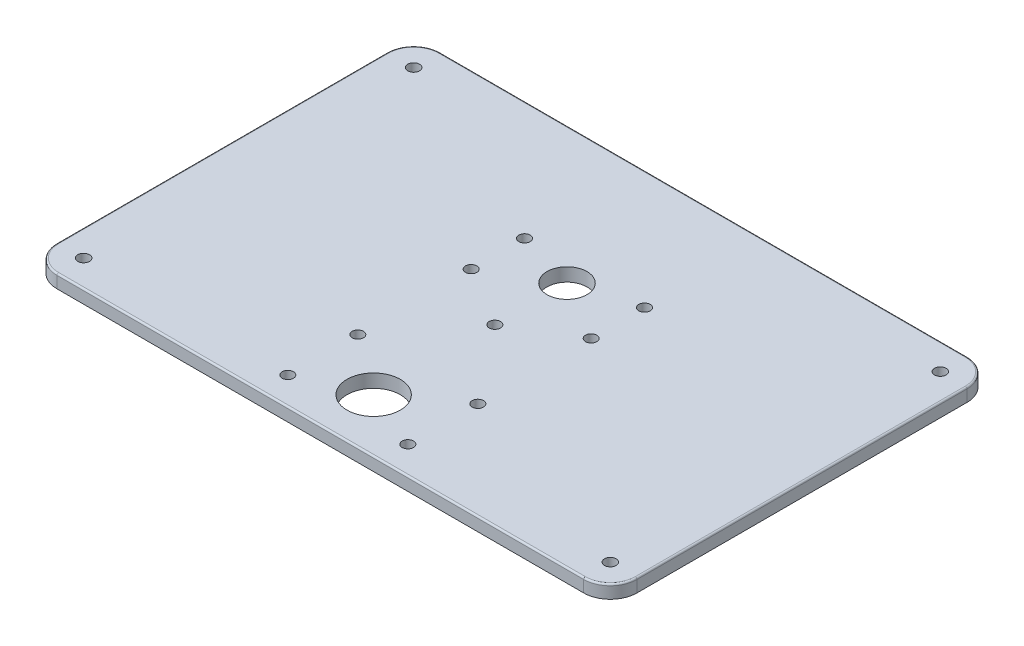
ISO-10303-21;
HEADER;
FILE_DESCRIPTION(('STEP AP214'),'2;1');
FILE_NAME('part.step','',(''),(''),'','','');
FILE_SCHEMA(('AUTOMOTIVE_DESIGN { 1 0 10303 214 1 1 1 1 }'));
ENDSEC;
DATA;
#1=APPLICATION_CONTEXT('core data for automotive mechanical design processes');
#2=APPLICATION_PROTOCOL_DEFINITION('international standard','automotive_design',2000,#1);
#3=PRODUCT_CONTEXT('',#1,'mechanical');
#4=PRODUCT('Part','Part','',(#3));
#5=PRODUCT_RELATED_PRODUCT_CATEGORY('part','',(#4));
#6=PRODUCT_DEFINITION_FORMATION('','',#4);
#7=PRODUCT_DEFINITION_CONTEXT('part definition',#1,'design');
#8=PRODUCT_DEFINITION('design','',#6,#7);
#9=PRODUCT_DEFINITION_SHAPE('','',#8);
#10=(LENGTH_UNIT() NAMED_UNIT(*) SI_UNIT(.MILLI.,.METRE.));
#11=(NAMED_UNIT(*) PLANE_ANGLE_UNIT() SI_UNIT($,.RADIAN.));
#12=(NAMED_UNIT(*) SI_UNIT($,.STERADIAN.) SOLID_ANGLE_UNIT());
#13=UNCERTAINTY_MEASURE_WITH_UNIT(LENGTH_MEASURE(1.E-05),#10,'distance_accuracy_value','');
#14=(GEOMETRIC_REPRESENTATION_CONTEXT(3) GLOBAL_UNCERTAINTY_ASSIGNED_CONTEXT((#13)) GLOBAL_UNIT_ASSIGNED_CONTEXT((#10,
#11,#12)) REPRESENTATION_CONTEXT('',''));
#15=CARTESIAN_POINT('',(0.,0.,0.));
#16=DIRECTION('',(0.,0.,1.));
#17=DIRECTION('',(1.,0.,0.));
#18=AXIS2_PLACEMENT_3D('',#15,#16,#17);
#19=CARTESIAN_POINT('',(79.,4.,11.));
#20=DIRECTION('',(0.,-1.,0.));
#21=DIRECTION('',(0.,0.,-1.));
#22=AXIS2_PLACEMENT_3D('',#19,#20,#21);
#23=PLANE('',#22);
#24=DIRECTION('',(0.,0.,1.));
#25=VECTOR('',#24,1.);
#26=CARTESIAN_POINT('',(-86.5,4.,11.));
#27=LINE('',#26,#25);
#28=CARTESIAN_POINT('',(-86.5,4.,-87.9999999999999));
#29=VERTEX_POINT('',#28);
#30=CARTESIAN_POINT('',(-86.5,4.,11.));
#31=VERTEX_POINT('',#30);
#32=EDGE_CURVE('E193',#29,#31,#27,.T.);
#33=ORIENTED_EDGE('',*,*,#32,.T.);
#34=CARTESIAN_POINT('',(-79.,4.,11.));
#35=DIRECTION('',(0.,-1.,0.));
#36=DIRECTION('',(0.,0.,-1.));
#37=AXIS2_PLACEMENT_3D('',#34,#35,#36);
#38=CIRCLE('',#37,7.50000000000002);
#39=CARTESIAN_POINT('',(-79.,4.,18.5));
#40=VERTEX_POINT('',#39);
#41=EDGE_CURVE('E195',#31,#40,#38,.F.);
#42=ORIENTED_EDGE('',*,*,#41,.T.);
#43=DIRECTION('',(1.,0.,0.));
#44=VECTOR('',#43,1.);
#45=CARTESIAN_POINT('',(79.,4.,18.5));
#46=LINE('',#45,#44);
#47=CARTESIAN_POINT('',(79.,4.,18.5));
#48=VERTEX_POINT('',#47);
#49=EDGE_CURVE('E132',#40,#48,#46,.T.);
#50=ORIENTED_EDGE('',*,*,#49,.T.);
#51=CARTESIAN_POINT('',(79.,4.,11.));
#52=DIRECTION('',(0.,-1.,0.));
#53=DIRECTION('',(0.,0.,-1.));
#54=AXIS2_PLACEMENT_3D('',#51,#52,#53);
#55=CIRCLE('',#54,7.50000000000002);
#56=CARTESIAN_POINT('',(86.5,4.,11.));
#57=VERTEX_POINT('',#56);
#58=EDGE_CURVE('E183',#48,#57,#55,.F.);
#59=ORIENTED_EDGE('',*,*,#58,.T.);
#60=DIRECTION('',(0.,0.,-1.));
#61=VECTOR('',#60,1.);
#62=CARTESIAN_POINT('',(86.5,4.,11.));
#63=LINE('',#62,#61);
#64=CARTESIAN_POINT('',(86.5,4.,-88.));
#65=VERTEX_POINT('',#64);
#66=EDGE_CURVE('E185',#57,#65,#63,.T.);
#67=ORIENTED_EDGE('',*,*,#66,.T.);
#68=CARTESIAN_POINT('',(79.,4.,-88.));
#69=DIRECTION('',(0.,-1.,0.));
#70=DIRECTION('',(0.,0.,-1.));
#71=AXIS2_PLACEMENT_3D('',#68,#69,#70);
#72=CIRCLE('',#71,7.50000000000001);
#73=CARTESIAN_POINT('',(78.9999999999999,4.,-95.5));
#74=VERTEX_POINT('',#73);
#75=EDGE_CURVE('E187',#65,#74,#72,.F.);
#76=ORIENTED_EDGE('',*,*,#75,.T.);
#77=DIRECTION('',(-1.,0.,0.));
#78=VECTOR('',#77,1.);
#79=CARTESIAN_POINT('',(78.9999999999999,4.,-95.5));
#80=LINE('',#79,#78);
#81=CARTESIAN_POINT('',(-78.9999999999999,4.,-95.5));
#82=VERTEX_POINT('',#81);
#83=EDGE_CURVE('E189',#74,#82,#80,.T.);
#84=ORIENTED_EDGE('',*,*,#83,.T.);
#85=CARTESIAN_POINT('',(-79.,4.,-88.));
#86=DIRECTION('',(0.,-1.,0.));
#87=DIRECTION('',(0.,0.,-1.));
#88=AXIS2_PLACEMENT_3D('',#85,#86,#87);
#89=CIRCLE('',#88,7.50000000000001);
#90=EDGE_CURVE('E191',#82,#29,#89,.F.);
#91=ORIENTED_EDGE('',*,*,#90,.T.);
#92=EDGE_LOOP('',(#33,#42,#50,#59,#67,#76,#84,#91));
#93=FACE_BOUND('',#92,.T.);
#94=CARTESIAN_POINT('',(0.,4.,3.00000000000002));
#95=DIRECTION('',(0.,1.,0.));
#96=DIRECTION('',(0.,0.,1.));
#97=AXIS2_PLACEMENT_3D('',#94,#95,#96);
#98=CIRCLE('',#97,8.0000000000001);
#99=CARTESIAN_POINT('',(0.,4.,11.0000000000001));
#100=VERTEX_POINT('',#99);
#101=EDGE_CURVE('E148',#100,#100,#98,.T.);
#102=ORIENTED_EDGE('',*,*,#101,.F.);
#103=EDGE_LOOP('',(#102));
#104=FACE_BOUND('',#103,.T.);
#105=CARTESIAN_POINT('',(18.,4.,10.750000000001));
#106=DIRECTION('',(0.,1.,0.));
#107=DIRECTION('',(0.,0.,1.));
#108=AXIS2_PLACEMENT_3D('',#105,#106,#107);
#109=CIRCLE('',#108,1.70000000000001);
#110=CARTESIAN_POINT('',(18.,4.,12.450000000001));
#111=VERTEX_POINT('',#110);
#112=EDGE_CURVE('E318',#111,#111,#109,.T.);
#113=ORIENTED_EDGE('',*,*,#112,.F.);
#114=EDGE_LOOP('',(#113));
#115=FACE_BOUND('',#114,.T.);
#116=CARTESIAN_POINT('',(18.,4.,-10.249999999999));
#117=DIRECTION('',(0.,1.,0.));
#118=DIRECTION('',(0.,0.,1.));
#119=AXIS2_PLACEMENT_3D('',#116,#117,#118);
#120=CIRCLE('',#119,1.70000000000001);
#121=CARTESIAN_POINT('',(18.,4.,-8.54999999999898));
#122=VERTEX_POINT('',#121);
#123=EDGE_CURVE('E312',#122,#122,#120,.T.);
#124=ORIENTED_EDGE('',*,*,#123,.F.);
#125=EDGE_LOOP('',(#124));
#126=FACE_BOUND('',#125,.T.);
#127=CARTESIAN_POINT('',(-18.,4.,10.750000000001));
#128=DIRECTION('',(0.,1.,0.));
#129=DIRECTION('',(0.,0.,1.));
#130=AXIS2_PLACEMENT_3D('',#127,#128,#129);
#131=CIRCLE('',#130,1.70000000000001);
#132=CARTESIAN_POINT('',(-18.,4.,12.450000000001));
#133=VERTEX_POINT('',#132);
#134=EDGE_CURVE('E306',#133,#133,#131,.T.);
#135=ORIENTED_EDGE('',*,*,#134,.F.);
#136=EDGE_LOOP('',(#135));
#137=FACE_BOUND('',#136,.T.);
#138=CARTESIAN_POINT('',(-18.,4.,-10.249999999999));
#139=DIRECTION('',(0.,1.,0.));
#140=DIRECTION('',(0.,0.,1.));
#141=AXIS2_PLACEMENT_3D('',#138,#139,#140);
#142=CIRCLE('',#141,1.70000000000001);
#143=CARTESIAN_POINT('',(-18.,4.,-8.54999999999898));
#144=VERTEX_POINT('',#143);
#145=EDGE_CURVE('E300',#144,#144,#142,.T.);
#146=ORIENTED_EDGE('',*,*,#145,.F.);
#147=EDGE_LOOP('',(#146));
#148=FACE_BOUND('',#147,.T.);
#149=CARTESIAN_POINT('',(0.,4.,-33.35));
#150=DIRECTION('',(0.,1.,0.));
#151=DIRECTION('',(0.,0.,1.));
#152=AXIS2_PLACEMENT_3D('',#149,#150,#151);
#153=CIRCLE('',#152,1.70000000000002);
#154=CARTESIAN_POINT('',(0.,4.,-31.65));
#155=VERTEX_POINT('',#154);
#156=EDGE_CURVE('E294',#155,#155,#153,.T.);
#157=ORIENTED_EDGE('',*,*,#156,.F.);
#158=EDGE_LOOP('',(#157));
#159=FACE_BOUND('',#158,.T.);
#160=CARTESIAN_POINT('',(18.,4.,-60.2499999999992));
#161=DIRECTION('',(0.,1.,0.));
#162=DIRECTION('',(0.,0.,1.));
#163=AXIS2_PLACEMENT_3D('',#160,#161,#162);
#164=CIRCLE('',#163,1.70000000000001);
#165=CARTESIAN_POINT('',(18.,4.,-58.5499999999992));
#166=VERTEX_POINT('',#165);
#167=EDGE_CURVE('E288',#166,#166,#164,.T.);
#168=ORIENTED_EDGE('',*,*,#167,.F.);
#169=EDGE_LOOP('',(#168));
#170=FACE_BOUND('',#169,.T.);
#171=CARTESIAN_POINT('',(18.,4.,-44.2499999999992));
#172=DIRECTION('',(0.,1.,0.));
#173=DIRECTION('',(0.,0.,1.));
#174=AXIS2_PLACEMENT_3D('',#171,#172,#173);
#175=CIRCLE('',#174,1.70000000000001);
#176=CARTESIAN_POINT('',(18.,4.,-42.5499999999992));
#177=VERTEX_POINT('',#176);
#178=EDGE_CURVE('E282',#177,#177,#175,.T.);
#179=ORIENTED_EDGE('',*,*,#178,.F.);
#180=EDGE_LOOP('',(#179));
#181=FACE_BOUND('',#180,.T.);
#182=CARTESIAN_POINT('',(-18.,4.,-44.2499999999992));
#183=DIRECTION('',(0.,1.,0.));
#184=DIRECTION('',(0.,0.,1.));
#185=AXIS2_PLACEMENT_3D('',#182,#183,#184);
#186=CIRCLE('',#185,1.70000000000001);
#187=CARTESIAN_POINT('',(-18.,4.,-42.5499999999992));
#188=VERTEX_POINT('',#187);
#189=EDGE_CURVE('E276',#188,#188,#186,.T.);
#190=ORIENTED_EDGE('',*,*,#189,.F.);
#191=EDGE_LOOP('',(#190));
#192=FACE_BOUND('',#191,.T.);
#193=CARTESIAN_POINT('',(0.,4.,-54.9999999999992));
#194=DIRECTION('',(0.,1.,0.));
#195=DIRECTION('',(0.,0.,1.));
#196=AXIS2_PLACEMENT_3D('',#193,#194,#195);
#197=CIRCLE('',#196,6.00000000000001);
#198=CARTESIAN_POINT('',(0.,4.,-48.9999999999992));
#199=VERTEX_POINT('',#198);
#200=EDGE_CURVE('E270',#199,#199,#197,.T.);
#201=ORIENTED_EDGE('',*,*,#200,.F.);
#202=EDGE_LOOP('',(#201));
#203=FACE_BOUND('',#202,.T.);
#204=CARTESIAN_POINT('',(-18.,4.,-60.2499999999992));
#205=DIRECTION('',(0.,1.,0.));
#206=DIRECTION('',(0.,0.,1.));
#207=AXIS2_PLACEMENT_3D('',#204,#205,#206);
#208=CIRCLE('',#207,1.70000000000001);
#209=CARTESIAN_POINT('',(-18.,4.,-58.5499999999992));
#210=VERTEX_POINT('',#209);
#211=EDGE_CURVE('E264',#210,#210,#208,.T.);
#212=ORIENTED_EDGE('',*,*,#211,.F.);
#213=EDGE_LOOP('',(#212));
#214=FACE_BOUND('',#213,.T.);
#215=CARTESIAN_POINT('',(-79.,4.,-88.));
#216=DIRECTION('',(0.,1.,0.));
#217=DIRECTION('',(0.,0.,1.));
#218=AXIS2_PLACEMENT_3D('',#215,#216,#217);
#219=CIRCLE('',#218,1.75000000000001);
#220=CARTESIAN_POINT('',(-79.,4.,-86.25));
#221=VERTEX_POINT('',#220);
#222=EDGE_CURVE('E258',#221,#221,#219,.T.);
#223=ORIENTED_EDGE('',*,*,#222,.F.);
#224=EDGE_LOOP('',(#223));
#225=FACE_BOUND('',#224,.T.);
#226=CARTESIAN_POINT('',(79.,4.,-88.));
#227=DIRECTION('',(0.,1.,0.));
#228=DIRECTION('',(0.,0.,1.));
#229=AXIS2_PLACEMENT_3D('',#226,#227,#228);
#230=CIRCLE('',#229,1.75000000000001);
#231=CARTESIAN_POINT('',(79.,4.,-86.25));
#232=VERTEX_POINT('',#231);
#233=EDGE_CURVE('E252',#232,#232,#230,.T.);
#234=ORIENTED_EDGE('',*,*,#233,.F.);
#235=EDGE_LOOP('',(#234));
#236=FACE_BOUND('',#235,.T.);
#237=CARTESIAN_POINT('',(79.,4.,11.));
#238=DIRECTION('',(0.,1.,0.));
#239=DIRECTION('',(0.,0.,1.));
#240=AXIS2_PLACEMENT_3D('',#237,#238,#239);
#241=CIRCLE('',#240,1.75000000000001);
#242=CARTESIAN_POINT('',(79.,4.,12.75));
#243=VERTEX_POINT('',#242);
#244=EDGE_CURVE('E246',#243,#243,#241,.T.);
#245=ORIENTED_EDGE('',*,*,#244,.F.);
#246=EDGE_LOOP('',(#245));
#247=FACE_BOUND('',#246,.T.);
#248=CARTESIAN_POINT('',(-79.,4.,11.));
#249=DIRECTION('',(0.,1.,0.));
#250=DIRECTION('',(0.,0.,1.));
#251=AXIS2_PLACEMENT_3D('',#248,#249,#250);
#252=CIRCLE('',#251,1.75000000000001);
#253=CARTESIAN_POINT('',(-79.,4.,12.75));
#254=VERTEX_POINT('',#253);
#255=EDGE_CURVE('E238',#254,#254,#252,.T.);
#256=ORIENTED_EDGE('',*,*,#255,.F.);
#257=EDGE_LOOP('',(#256));
#258=FACE_BOUND('',#257,.T.);
#259=ADVANCED_FACE('F37',(#93,#104,#115,#126,#137,#148,#159,#170,#181,#192,#203,#214,#225,#236,
#247,#258),#23,.F.);
#260=CARTESIAN_POINT('',(79.,0.,11.));
#261=DIRECTION('',(0.,-1.,0.));
#262=DIRECTION('',(0.,0.,-1.));
#263=AXIS2_PLACEMENT_3D('',#260,#261,#262);
#264=PLANE('',#263);
#265=CARTESIAN_POINT('',(79.,0.,11.));
#266=DIRECTION('',(0.,1.,0.));
#267=DIRECTION('',(0.,0.,1.));
#268=AXIS2_PLACEMENT_3D('',#265,#266,#267);
#269=CIRCLE('',#268,1.75000000000001);
#270=CARTESIAN_POINT('',(79.,0.,12.75));
#271=VERTEX_POINT('',#270);
#272=EDGE_CURVE('E243',#271,#271,#269,.T.);
#273=ORIENTED_EDGE('',*,*,#272,.T.);
#274=EDGE_LOOP('',(#273));
#275=FACE_BOUND('',#274,.T.);
#276=CARTESIAN_POINT('',(-79.,0.,-88.));
#277=DIRECTION('',(0.,1.,0.));
#278=DIRECTION('',(0.,0.,1.));
#279=AXIS2_PLACEMENT_3D('',#276,#277,#278);
#280=CIRCLE('',#279,1.75000000000001);
#281=CARTESIAN_POINT('',(-79.,0.,-86.25));
#282=VERTEX_POINT('',#281);
#283=EDGE_CURVE('E255',#282,#282,#280,.T.);
#284=ORIENTED_EDGE('',*,*,#283,.T.);
#285=EDGE_LOOP('',(#284));
#286=FACE_BOUND('',#285,.T.);
#287=CARTESIAN_POINT('',(0.,0.,-54.9999999999992));
#288=DIRECTION('',(0.,1.,0.));
#289=DIRECTION('',(0.,0.,1.));
#290=AXIS2_PLACEMENT_3D('',#287,#288,#289);
#291=CIRCLE('',#290,6.00000000000001);
#292=CARTESIAN_POINT('',(0.,0.,-48.9999999999992));
#293=VERTEX_POINT('',#292);
#294=EDGE_CURVE('E267',#293,#293,#291,.T.);
#295=ORIENTED_EDGE('',*,*,#294,.T.);
#296=EDGE_LOOP('',(#295));
#297=FACE_BOUND('',#296,.T.);
#298=CARTESIAN_POINT('',(18.,0.,-44.2499999999992));
#299=DIRECTION('',(0.,1.,0.));
#300=DIRECTION('',(0.,0.,1.));
#301=AXIS2_PLACEMENT_3D('',#298,#299,#300);
#302=CIRCLE('',#301,1.70000000000001);
#303=CARTESIAN_POINT('',(18.,0.,-42.5499999999992));
#304=VERTEX_POINT('',#303);
#305=EDGE_CURVE('E279',#304,#304,#302,.T.);
#306=ORIENTED_EDGE('',*,*,#305,.T.);
#307=EDGE_LOOP('',(#306));
#308=FACE_BOUND('',#307,.T.);
#309=CARTESIAN_POINT('',(0.,0.,-33.35));
#310=DIRECTION('',(0.,1.,0.));
#311=DIRECTION('',(0.,0.,1.));
#312=AXIS2_PLACEMENT_3D('',#309,#310,#311);
#313=CIRCLE('',#312,1.70000000000002);
#314=CARTESIAN_POINT('',(0.,0.,-31.65));
#315=VERTEX_POINT('',#314);
#316=EDGE_CURVE('E291',#315,#315,#313,.T.);
#317=ORIENTED_EDGE('',*,*,#316,.T.);
#318=EDGE_LOOP('',(#317));
#319=FACE_BOUND('',#318,.T.);
#320=CARTESIAN_POINT('',(-18.,0.,10.750000000001));
#321=DIRECTION('',(0.,1.,0.));
#322=DIRECTION('',(0.,0.,1.));
#323=AXIS2_PLACEMENT_3D('',#320,#321,#322);
#324=CIRCLE('',#323,1.70000000000001);
#325=CARTESIAN_POINT('',(-18.,0.,12.450000000001));
#326=VERTEX_POINT('',#325);
#327=EDGE_CURVE('E303',#326,#326,#324,.T.);
#328=ORIENTED_EDGE('',*,*,#327,.T.);
#329=EDGE_LOOP('',(#328));
#330=FACE_BOUND('',#329,.T.);
#331=CARTESIAN_POINT('',(18.,0.,10.750000000001));
#332=DIRECTION('',(0.,1.,0.));
#333=DIRECTION('',(0.,0.,1.));
#334=AXIS2_PLACEMENT_3D('',#331,#332,#333);
#335=CIRCLE('',#334,1.70000000000001);
#336=CARTESIAN_POINT('',(18.,0.,12.450000000001));
#337=VERTEX_POINT('',#336);
#338=EDGE_CURVE('E315',#337,#337,#335,.T.);
#339=ORIENTED_EDGE('',*,*,#338,.T.);
#340=EDGE_LOOP('',(#339));
#341=FACE_BOUND('',#340,.T.);
#342=CARTESIAN_POINT('',(79.,0.,11.));
#343=DIRECTION('',(0.,1.,0.));
#344=DIRECTION('',(0.,0.,-1.));
#345=AXIS2_PLACEMENT_3D('',#342,#343,#344);
#346=CIRCLE('',#345,8.00000000000002);
#347=CARTESIAN_POINT('',(79.,0.,19.));
#348=VERTEX_POINT('',#347);
#349=CARTESIAN_POINT('',(87.,0.,11.));
#350=VERTEX_POINT('',#349);
#351=EDGE_CURVE('E140',#348,#350,#346,.T.);
#352=ORIENTED_EDGE('',*,*,#351,.F.);
#353=DIRECTION('',(1.,0.,0.));
#354=VECTOR('',#353,1.);
#355=CARTESIAN_POINT('',(-79.,0.,19.));
#356=LINE('',#355,#354);
#357=CARTESIAN_POINT('',(-79.,0.,19.));
#358=VERTEX_POINT('',#357);
#359=EDGE_CURVE('E168',#358,#348,#356,.T.);
#360=ORIENTED_EDGE('',*,*,#359,.F.);
#361=CARTESIAN_POINT('',(-79.,0.,11.));
#362=DIRECTION('',(0.,1.,0.));
#363=DIRECTION('',(0.,0.,1.));
#364=AXIS2_PLACEMENT_3D('',#361,#362,#363);
#365=CIRCLE('',#364,8.00000000000002);
#366=CARTESIAN_POINT('',(-87.,0.,11.));
#367=VERTEX_POINT('',#366);
#368=EDGE_CURVE('E165',#367,#358,#365,.T.);
#369=ORIENTED_EDGE('',*,*,#368,.F.);
#370=DIRECTION('',(0.,0.,1.));
#371=VECTOR('',#370,1.);
#372=CARTESIAN_POINT('',(-87.,0.,-87.9999999999999));
#373=LINE('',#372,#371);
#374=CARTESIAN_POINT('',(-87.,0.,-87.9999999999999));
#375=VERTEX_POINT('',#374);
#376=EDGE_CURVE('E162',#375,#367,#373,.T.);
#377=ORIENTED_EDGE('',*,*,#376,.F.);
#378=CARTESIAN_POINT('',(-79.,0.,-88.));
#379=DIRECTION('',(0.,1.,0.));
#380=DIRECTION('',(0.,0.,1.));
#381=AXIS2_PLACEMENT_3D('',#378,#379,#380);
#382=CIRCLE('',#381,8.00000000000001);
#383=CARTESIAN_POINT('',(-78.9999999999999,0.,-96.));
#384=VERTEX_POINT('',#383);
#385=EDGE_CURVE('E159',#384,#375,#382,.T.);
#386=ORIENTED_EDGE('',*,*,#385,.F.);
#387=DIRECTION('',(-1.,0.,0.));
#388=VECTOR('',#387,1.);
#389=CARTESIAN_POINT('',(78.9999999999999,0.,-96.));
#390=LINE('',#389,#388);
#391=CARTESIAN_POINT('',(78.9999999999999,0.,-96.));
#392=VERTEX_POINT('',#391);
#393=EDGE_CURVE('E156',#392,#384,#390,.T.);
#394=ORIENTED_EDGE('',*,*,#393,.F.);
#395=CARTESIAN_POINT('',(79.,0.,-88.));
#396=DIRECTION('',(0.,1.,0.));
#397=DIRECTION('',(0.,0.,1.));
#398=AXIS2_PLACEMENT_3D('',#395,#396,#397);
#399=CIRCLE('',#398,8.00000000000001);
#400=CARTESIAN_POINT('',(87.,0.,-88.));
#401=VERTEX_POINT('',#400);
#402=EDGE_CURVE('E143',#401,#392,#399,.T.);
#403=ORIENTED_EDGE('',*,*,#402,.F.);
#404=DIRECTION('',(0.,0.,-1.));
#405=VECTOR('',#404,1.);
#406=CARTESIAN_POINT('',(87.,0.,11.));
#407=LINE('',#406,#405);
#408=EDGE_CURVE('E128',#350,#401,#407,.T.);
#409=ORIENTED_EDGE('',*,*,#408,.F.);
#410=EDGE_LOOP('',(#352,#360,#369,#377,#386,#394,#403,#409));
#411=FACE_BOUND('',#410,.T.);
#412=CARTESIAN_POINT('',(0.,0.,3.00000000000002));
#413=DIRECTION('',(0.,1.,0.));
#414=DIRECTION('',(0.,0.,1.));
#415=AXIS2_PLACEMENT_3D('',#412,#413,#414);
#416=CIRCLE('',#415,8.0000000000001);
#417=CARTESIAN_POINT('',(0.,0.,11.0000000000001));
#418=VERTEX_POINT('',#417);
#419=EDGE_CURVE('E151',#418,#418,#416,.T.);
#420=ORIENTED_EDGE('',*,*,#419,.T.);
#421=EDGE_LOOP('',(#420));
#422=FACE_BOUND('',#421,.T.);
#423=CARTESIAN_POINT('',(18.,0.,-10.249999999999));
#424=DIRECTION('',(0.,1.,0.));
#425=DIRECTION('',(0.,0.,1.));
#426=AXIS2_PLACEMENT_3D('',#423,#424,#425);
#427=CIRCLE('',#426,1.70000000000001);
#428=CARTESIAN_POINT('',(18.,0.,-8.54999999999898));
#429=VERTEX_POINT('',#428);
#430=EDGE_CURVE('E309',#429,#429,#427,.T.);
#431=ORIENTED_EDGE('',*,*,#430,.T.);
#432=EDGE_LOOP('',(#431));
#433=FACE_BOUND('',#432,.T.);
#434=CARTESIAN_POINT('',(-18.,0.,-10.249999999999));
#435=DIRECTION('',(0.,1.,0.));
#436=DIRECTION('',(0.,0.,1.));
#437=AXIS2_PLACEMENT_3D('',#434,#435,#436);
#438=CIRCLE('',#437,1.70000000000001);
#439=CARTESIAN_POINT('',(-18.,0.,-8.54999999999898));
#440=VERTEX_POINT('',#439);
#441=EDGE_CURVE('E297',#440,#440,#438,.T.);
#442=ORIENTED_EDGE('',*,*,#441,.T.);
#443=EDGE_LOOP('',(#442));
#444=FACE_BOUND('',#443,.T.);
#445=CARTESIAN_POINT('',(18.,0.,-60.2499999999992));
#446=DIRECTION('',(0.,1.,0.));
#447=DIRECTION('',(0.,0.,1.));
#448=AXIS2_PLACEMENT_3D('',#445,#446,#447);
#449=CIRCLE('',#448,1.70000000000001);
#450=CARTESIAN_POINT('',(18.,0.,-58.5499999999992));
#451=VERTEX_POINT('',#450);
#452=EDGE_CURVE('E285',#451,#451,#449,.T.);
#453=ORIENTED_EDGE('',*,*,#452,.T.);
#454=EDGE_LOOP('',(#453));
#455=FACE_BOUND('',#454,.T.);
#456=CARTESIAN_POINT('',(-18.,0.,-44.2499999999992));
#457=DIRECTION('',(0.,1.,0.));
#458=DIRECTION('',(0.,0.,1.));
#459=AXIS2_PLACEMENT_3D('',#456,#457,#458);
#460=CIRCLE('',#459,1.70000000000001);
#461=CARTESIAN_POINT('',(-18.,0.,-42.5499999999992));
#462=VERTEX_POINT('',#461);
#463=EDGE_CURVE('E273',#462,#462,#460,.T.);
#464=ORIENTED_EDGE('',*,*,#463,.T.);
#465=EDGE_LOOP('',(#464));
#466=FACE_BOUND('',#465,.T.);
#467=CARTESIAN_POINT('',(-18.,0.,-60.2499999999992));
#468=DIRECTION('',(0.,1.,0.));
#469=DIRECTION('',(0.,0.,1.));
#470=AXIS2_PLACEMENT_3D('',#467,#468,#469);
#471=CIRCLE('',#470,1.70000000000001);
#472=CARTESIAN_POINT('',(-18.,0.,-58.5499999999992));
#473=VERTEX_POINT('',#472);
#474=EDGE_CURVE('E261',#473,#473,#471,.T.);
#475=ORIENTED_EDGE('',*,*,#474,.T.);
#476=EDGE_LOOP('',(#475));
#477=FACE_BOUND('',#476,.T.);
#478=CARTESIAN_POINT('',(79.,0.,-88.));
#479=DIRECTION('',(0.,1.,0.));
#480=DIRECTION('',(0.,0.,1.));
#481=AXIS2_PLACEMENT_3D('',#478,#479,#480);
#482=CIRCLE('',#481,1.75000000000001);
#483=CARTESIAN_POINT('',(79.,0.,-86.25));
#484=VERTEX_POINT('',#483);
#485=EDGE_CURVE('E249',#484,#484,#482,.T.);
#486=ORIENTED_EDGE('',*,*,#485,.T.);
#487=EDGE_LOOP('',(#486));
#488=FACE_BOUND('',#487,.T.);
#489=CARTESIAN_POINT('',(-79.,0.,11.));
#490=DIRECTION('',(0.,1.,0.));
#491=DIRECTION('',(0.,0.,1.));
#492=AXIS2_PLACEMENT_3D('',#489,#490,#491);
#493=CIRCLE('',#492,1.75000000000001);
#494=CARTESIAN_POINT('',(-79.,0.,12.75));
#495=VERTEX_POINT('',#494);
#496=EDGE_CURVE('E232',#495,#495,#493,.T.);
#497=ORIENTED_EDGE('',*,*,#496,.T.);
#498=EDGE_LOOP('',(#497));
#499=FACE_BOUND('',#498,.T.);
#500=ADVANCED_FACE('F137',(#275,#286,#297,#308,#319,#330,#341,#411,#422,#433,#444,#455,#466,
#477,#488,#499),#264,.T.);
#501=CARTESIAN_POINT('',(79.,4.,11.));
#502=DIRECTION('',(0.,-1.,0.));
#503=DIRECTION('',(0.,0.,-1.));
#504=AXIS2_PLACEMENT_3D('',#501,#502,#503);
#505=CYLINDRICAL_SURFACE('',#504,8.00000000000002);
#506=DIRECTION('',(0.,-1.,0.));
#507=VECTOR('',#506,1.);
#508=CARTESIAN_POINT('',(87.,4.,11.));
#509=LINE('',#508,#507);
#510=CARTESIAN_POINT('',(87.,3.5,11.));
#511=VERTEX_POINT('',#510);
#512=EDGE_CURVE('E125',#511,#350,#509,.T.);
#513=ORIENTED_EDGE('',*,*,#512,.F.);
#514=CARTESIAN_POINT('',(79.,3.5,11.));
#515=DIRECTION('',(0.,-1.,0.));
#516=DIRECTION('',(0.,0.,-1.));
#517=AXIS2_PLACEMENT_3D('',#514,#515,#516);
#518=CIRCLE('',#517,8.00000000000002);
#519=CARTESIAN_POINT('',(79.,3.5,19.));
#520=VERTEX_POINT('',#519);
#521=EDGE_CURVE('E46',#511,#520,#518,.T.);
#522=ORIENTED_EDGE('',*,*,#521,.T.);
#523=DIRECTION('',(0.,-1.,0.));
#524=VECTOR('',#523,1.);
#525=CARTESIAN_POINT('',(79.,4.,19.));
#526=LINE('',#525,#524);
#527=EDGE_CURVE('E146',#520,#348,#526,.T.);
#528=ORIENTED_EDGE('',*,*,#527,.T.);
#529=ORIENTED_EDGE('',*,*,#351,.T.);
#530=EDGE_LOOP('',(#513,#522,#528,#529));
#531=FACE_BOUND('',#530,.T.);
#532=ADVANCED_FACE('F145',(#531),#505,.T.);
#533=CARTESIAN_POINT('',(87.,4.,11.));
#534=DIRECTION('',(-1.,0.,0.));
#535=DIRECTION('',(0.,0.,1.));
#536=AXIS2_PLACEMENT_3D('',#533,#534,#535);
#537=PLANE('',#536);
#538=DIRECTION('',(0.,-1.,0.));
#539=VECTOR('',#538,1.);
#540=CARTESIAN_POINT('',(87.,4.,-88.));
#541=LINE('',#540,#539);
#542=CARTESIAN_POINT('',(87.,3.5,-88.));
#543=VERTEX_POINT('',#542);
#544=EDGE_CURVE('E133',#543,#401,#541,.T.);
#545=ORIENTED_EDGE('',*,*,#544,.F.);
#546=DIRECTION('',(0.,0.,-1.));
#547=VECTOR('',#546,1.);
#548=CARTESIAN_POINT('',(87.,3.5,11.));
#549=LINE('',#548,#547);
#550=EDGE_CURVE('E61',#543,#511,#549,.F.);
#551=ORIENTED_EDGE('',*,*,#550,.T.);
#552=ORIENTED_EDGE('',*,*,#512,.T.);
#553=ORIENTED_EDGE('',*,*,#408,.T.);
#554=EDGE_LOOP('',(#545,#551,#552,#553));
#555=FACE_BOUND('',#554,.T.);
#556=ADVANCED_FACE('F127',(#555),#537,.F.);
#557=CARTESIAN_POINT('',(79.,4.,-88.));
#558=DIRECTION('',(0.,-1.,0.));
#559=DIRECTION('',(0.,0.,-1.));
#560=AXIS2_PLACEMENT_3D('',#557,#558,#559);
#561=CYLINDRICAL_SURFACE('',#560,8.00000000000001);
#562=DIRECTION('',(0.,-1.,0.));
#563=VECTOR('',#562,1.);
#564=CARTESIAN_POINT('',(78.9999999999999,4.,-96.));
#565=LINE('',#564,#563);
#566=CARTESIAN_POINT('',(78.9999999999999,3.5,-96.));
#567=VERTEX_POINT('',#566);
#568=EDGE_CURVE('E179',#567,#392,#565,.T.);
#569=ORIENTED_EDGE('',*,*,#568,.F.);
#570=CARTESIAN_POINT('',(79.,3.5,-88.));
#571=DIRECTION('',(0.,-1.,0.));
#572=DIRECTION('',(0.,0.,-1.));
#573=AXIS2_PLACEMENT_3D('',#570,#571,#572);
#574=CIRCLE('',#573,8.00000000000001);
#575=EDGE_CURVE('E207',#567,#543,#574,.T.);
#576=ORIENTED_EDGE('',*,*,#575,.T.);
#577=ORIENTED_EDGE('',*,*,#544,.T.);
#578=ORIENTED_EDGE('',*,*,#402,.T.);
#579=EDGE_LOOP('',(#569,#576,#577,#578));
#580=FACE_BOUND('',#579,.T.);
#581=ADVANCED_FACE('F369',(#580),#561,.T.);
#582=CARTESIAN_POINT('',(78.9999999999999,4.,-96.));
#583=DIRECTION('',(0.,0.,1.));
#584=DIRECTION('',(1.,0.,0.));
#585=AXIS2_PLACEMENT_3D('',#582,#583,#584);
#586=PLANE('',#585);
#587=DIRECTION('',(0.,-1.,0.));
#588=VECTOR('',#587,1.);
#589=CARTESIAN_POINT('',(-78.9999999999999,4.,-96.));
#590=LINE('',#589,#588);
#591=CARTESIAN_POINT('',(-78.9999999999999,3.5,-96.));
#592=VERTEX_POINT('',#591);
#593=EDGE_CURVE('E177',#592,#384,#590,.T.);
#594=ORIENTED_EDGE('',*,*,#593,.F.);
#595=DIRECTION('',(-1.,0.,0.));
#596=VECTOR('',#595,1.);
#597=CARTESIAN_POINT('',(78.9999999999999,3.5,-96.));
#598=LINE('',#597,#596);
#599=EDGE_CURVE('E205',#592,#567,#598,.F.);
#600=ORIENTED_EDGE('',*,*,#599,.T.);
#601=ORIENTED_EDGE('',*,*,#568,.T.);
#602=ORIENTED_EDGE('',*,*,#393,.T.);
#603=EDGE_LOOP('',(#594,#600,#601,#602));
#604=FACE_BOUND('',#603,.T.);
#605=ADVANCED_FACE('F365',(#604),#586,.F.);
#606=CARTESIAN_POINT('',(-79.,4.,-88.));
#607=DIRECTION('',(0.,-1.,0.));
#608=DIRECTION('',(0.,0.,-1.));
#609=AXIS2_PLACEMENT_3D('',#606,#607,#608);
#610=CYLINDRICAL_SURFACE('',#609,8.00000000000001);
#611=DIRECTION('',(0.,-1.,0.));
#612=VECTOR('',#611,1.);
#613=CARTESIAN_POINT('',(-87.,4.,-87.9999999999999));
#614=LINE('',#613,#612);
#615=CARTESIAN_POINT('',(-87.,3.5,-87.9999999999999));
#616=VERTEX_POINT('',#615);
#617=EDGE_CURVE('E175',#616,#375,#614,.T.);
#618=ORIENTED_EDGE('',*,*,#617,.F.);
#619=CARTESIAN_POINT('',(-79.,3.5,-88.));
#620=DIRECTION('',(0.,-1.,0.));
#621=DIRECTION('',(0.,0.,-1.));
#622=AXIS2_PLACEMENT_3D('',#619,#620,#621);
#623=CIRCLE('',#622,8.00000000000001);
#624=EDGE_CURVE('E203',#616,#592,#623,.T.);
#625=ORIENTED_EDGE('',*,*,#624,.T.);
#626=ORIENTED_EDGE('',*,*,#593,.T.);
#627=ORIENTED_EDGE('',*,*,#385,.T.);
#628=EDGE_LOOP('',(#618,#625,#626,#627));
#629=FACE_BOUND('',#628,.T.);
#630=ADVANCED_FACE('F361',(#629),#610,.T.);
#631=CARTESIAN_POINT('',(-87.,4.,-87.9999999999999));
#632=DIRECTION('',(1.,0.,0.));
#633=DIRECTION('',(0.,0.,-1.));
#634=AXIS2_PLACEMENT_3D('',#631,#632,#633);
#635=PLANE('',#634);
#636=DIRECTION('',(0.,-1.,0.));
#637=VECTOR('',#636,1.);
#638=CARTESIAN_POINT('',(-87.,4.,11.));
#639=LINE('',#638,#637);
#640=CARTESIAN_POINT('',(-87.,3.5,11.));
#641=VERTEX_POINT('',#640);
#642=EDGE_CURVE('E173',#641,#367,#639,.T.);
#643=ORIENTED_EDGE('',*,*,#642,.F.);
#644=DIRECTION('',(0.,0.,1.));
#645=VECTOR('',#644,1.);
#646=CARTESIAN_POINT('',(-87.,3.5,-87.9999999999999));
#647=LINE('',#646,#645);
#648=EDGE_CURVE('E201',#641,#616,#647,.F.);
#649=ORIENTED_EDGE('',*,*,#648,.T.);
#650=ORIENTED_EDGE('',*,*,#617,.T.);
#651=ORIENTED_EDGE('',*,*,#376,.T.);
#652=EDGE_LOOP('',(#643,#649,#650,#651));
#653=FACE_BOUND('',#652,.T.);
#654=ADVANCED_FACE('F357',(#653),#635,.F.);
#655=CARTESIAN_POINT('',(-79.,4.,11.));
#656=DIRECTION('',(0.,-1.,0.));
#657=DIRECTION('',(0.,0.,-1.));
#658=AXIS2_PLACEMENT_3D('',#655,#656,#657);
#659=CYLINDRICAL_SURFACE('',#658,8.00000000000002);
#660=DIRECTION('',(0.,-1.,0.));
#661=VECTOR('',#660,1.);
#662=CARTESIAN_POINT('',(-79.,4.,19.));
#663=LINE('',#662,#661);
#664=CARTESIAN_POINT('',(-79.,3.5,19.));
#665=VERTEX_POINT('',#664);
#666=EDGE_CURVE('E171',#665,#358,#663,.T.);
#667=ORIENTED_EDGE('',*,*,#666,.F.);
#668=CARTESIAN_POINT('',(-79.,3.5,11.));
#669=DIRECTION('',(0.,-1.,0.));
#670=DIRECTION('',(0.,0.,-1.));
#671=AXIS2_PLACEMENT_3D('',#668,#669,#670);
#672=CIRCLE('',#671,8.00000000000002);
#673=EDGE_CURVE('E198',#665,#641,#672,.T.);
#674=ORIENTED_EDGE('',*,*,#673,.T.);
#675=ORIENTED_EDGE('',*,*,#642,.T.);
#676=ORIENTED_EDGE('',*,*,#368,.T.);
#677=EDGE_LOOP('',(#667,#674,#675,#676));
#678=FACE_BOUND('',#677,.T.);
#679=ADVANCED_FACE('F353',(#678),#659,.T.);
#680=CARTESIAN_POINT('',(-79.,4.,19.));
#681=DIRECTION('',(0.,0.,-1.));
#682=DIRECTION('',(-1.,0.,0.));
#683=AXIS2_PLACEMENT_3D('',#680,#681,#682);
#684=PLANE('',#683);
#685=ORIENTED_EDGE('',*,*,#527,.F.);
#686=DIRECTION('',(1.,0.,0.));
#687=VECTOR('',#686,1.);
#688=CARTESIAN_POINT('',(-79.,3.5,19.));
#689=LINE('',#688,#687);
#690=EDGE_CURVE('E11',#520,#665,#689,.F.);
#691=ORIENTED_EDGE('',*,*,#690,.T.);
#692=ORIENTED_EDGE('',*,*,#666,.T.);
#693=ORIENTED_EDGE('',*,*,#359,.T.);
#694=EDGE_LOOP('',(#685,#691,#692,#693));
#695=FACE_BOUND('',#694,.T.);
#696=ADVANCED_FACE('F338',(#695),#684,.F.);
#697=CARTESIAN_POINT('',(0.,4.,3.00000000000002));
#698=DIRECTION('',(0.,-1.,0.));
#699=DIRECTION('',(0.,0.,-1.));
#700=AXIS2_PLACEMENT_3D('',#697,#698,#699);
#701=CYLINDRICAL_SURFACE('',#700,8.0000000000001);
#702=ORIENTED_EDGE('',*,*,#101,.T.);
#703=EDGE_LOOP('',(#702));
#704=FACE_BOUND('',#703,.T.);
#705=ORIENTED_EDGE('',*,*,#419,.F.);
#706=EDGE_LOOP('',(#705));
#707=FACE_BOUND('',#706,.T.);
#708=ADVANCED_FACE('F328',(#704,#707),#701,.F.);
#709=CARTESIAN_POINT('',(18.,4.,10.750000000001));
#710=DIRECTION('',(0.,-1.,0.));
#711=DIRECTION('',(0.,0.,-1.));
#712=AXIS2_PLACEMENT_3D('',#709,#710,#711);
#713=CYLINDRICAL_SURFACE('',#712,1.70000000000001);
#714=ORIENTED_EDGE('',*,*,#112,.T.);
#715=EDGE_LOOP('',(#714));
#716=FACE_BOUND('',#715,.T.);
#717=ORIENTED_EDGE('',*,*,#338,.F.);
#718=EDGE_LOOP('',(#717));
#719=FACE_BOUND('',#718,.T.);
#720=ADVANCED_FACE('F325',(#716,#719),#713,.F.);
#721=CARTESIAN_POINT('',(18.,4.,-10.249999999999));
#722=DIRECTION('',(0.,-1.,0.));
#723=DIRECTION('',(0.,0.,-1.));
#724=AXIS2_PLACEMENT_3D('',#721,#722,#723);
#725=CYLINDRICAL_SURFACE('',#724,1.70000000000001);
#726=ORIENTED_EDGE('',*,*,#123,.T.);
#727=EDGE_LOOP('',(#726));
#728=FACE_BOUND('',#727,.T.);
#729=ORIENTED_EDGE('',*,*,#430,.F.);
#730=EDGE_LOOP('',(#729));
#731=FACE_BOUND('',#730,.T.);
#732=ADVANCED_FACE('F327',(#728,#731),#725,.F.);
#733=CARTESIAN_POINT('',(-18.,4.,10.750000000001));
#734=DIRECTION('',(0.,-1.,0.));
#735=DIRECTION('',(0.,0.,-1.));
#736=AXIS2_PLACEMENT_3D('',#733,#734,#735);
#737=CYLINDRICAL_SURFACE('',#736,1.70000000000001);
#738=ORIENTED_EDGE('',*,*,#134,.T.);
#739=EDGE_LOOP('',(#738));
#740=FACE_BOUND('',#739,.T.);
#741=ORIENTED_EDGE('',*,*,#327,.F.);
#742=EDGE_LOOP('',(#741));
#743=FACE_BOUND('',#742,.T.);
#744=ADVANCED_FACE('F335',(#740,#743),#737,.F.);
#745=CARTESIAN_POINT('',(-18.,4.,-10.249999999999));
#746=DIRECTION('',(0.,-1.,0.));
#747=DIRECTION('',(0.,0.,-1.));
#748=AXIS2_PLACEMENT_3D('',#745,#746,#747);
#749=CYLINDRICAL_SURFACE('',#748,1.70000000000001);
#750=ORIENTED_EDGE('',*,*,#145,.T.);
#751=EDGE_LOOP('',(#750));
#752=FACE_BOUND('',#751,.T.);
#753=ORIENTED_EDGE('',*,*,#441,.F.);
#754=EDGE_LOOP('',(#753));
#755=FACE_BOUND('',#754,.T.);
#756=ADVANCED_FACE('F475',(#752,#755),#749,.F.);
#757=CARTESIAN_POINT('',(0.,4.,-33.35));
#758=DIRECTION('',(0.,-1.,0.));
#759=DIRECTION('',(0.,0.,-1.));
#760=AXIS2_PLACEMENT_3D('',#757,#758,#759);
#761=CYLINDRICAL_SURFACE('',#760,1.70000000000002);
#762=ORIENTED_EDGE('',*,*,#156,.T.);
#763=EDGE_LOOP('',(#762));
#764=FACE_BOUND('',#763,.T.);
#765=ORIENTED_EDGE('',*,*,#316,.F.);
#766=EDGE_LOOP('',(#765));
#767=FACE_BOUND('',#766,.T.);
#768=ADVANCED_FACE('F471',(#764,#767),#761,.F.);
#769=CARTESIAN_POINT('',(18.,4.,-60.2499999999992));
#770=DIRECTION('',(0.,-1.,0.));
#771=DIRECTION('',(0.,0.,-1.));
#772=AXIS2_PLACEMENT_3D('',#769,#770,#771);
#773=CYLINDRICAL_SURFACE('',#772,1.70000000000001);
#774=ORIENTED_EDGE('',*,*,#167,.T.);
#775=EDGE_LOOP('',(#774));
#776=FACE_BOUND('',#775,.T.);
#777=ORIENTED_EDGE('',*,*,#452,.F.);
#778=EDGE_LOOP('',(#777));
#779=FACE_BOUND('',#778,.T.);
#780=ADVANCED_FACE('F467',(#776,#779),#773,.F.);
#781=CARTESIAN_POINT('',(18.,4.,-44.2499999999992));
#782=DIRECTION('',(0.,-1.,0.));
#783=DIRECTION('',(0.,0.,-1.));
#784=AXIS2_PLACEMENT_3D('',#781,#782,#783);
#785=CYLINDRICAL_SURFACE('',#784,1.70000000000001);
#786=ORIENTED_EDGE('',*,*,#178,.T.);
#787=EDGE_LOOP('',(#786));
#788=FACE_BOUND('',#787,.T.);
#789=ORIENTED_EDGE('',*,*,#305,.F.);
#790=EDGE_LOOP('',(#789));
#791=FACE_BOUND('',#790,.T.);
#792=ADVANCED_FACE('F463',(#788,#791),#785,.F.);
#793=CARTESIAN_POINT('',(-18.,4.,-44.2499999999992));
#794=DIRECTION('',(0.,-1.,0.));
#795=DIRECTION('',(0.,0.,-1.));
#796=AXIS2_PLACEMENT_3D('',#793,#794,#795);
#797=CYLINDRICAL_SURFACE('',#796,1.70000000000001);
#798=ORIENTED_EDGE('',*,*,#189,.T.);
#799=EDGE_LOOP('',(#798));
#800=FACE_BOUND('',#799,.T.);
#801=ORIENTED_EDGE('',*,*,#463,.F.);
#802=EDGE_LOOP('',(#801));
#803=FACE_BOUND('',#802,.T.);
#804=ADVANCED_FACE('F459',(#800,#803),#797,.F.);
#805=CARTESIAN_POINT('',(0.,4.,-54.9999999999992));
#806=DIRECTION('',(0.,-1.,0.));
#807=DIRECTION('',(0.,0.,-1.));
#808=AXIS2_PLACEMENT_3D('',#805,#806,#807);
#809=CYLINDRICAL_SURFACE('',#808,6.00000000000001);
#810=ORIENTED_EDGE('',*,*,#200,.T.);
#811=EDGE_LOOP('',(#810));
#812=FACE_BOUND('',#811,.T.);
#813=ORIENTED_EDGE('',*,*,#294,.F.);
#814=EDGE_LOOP('',(#813));
#815=FACE_BOUND('',#814,.T.);
#816=ADVANCED_FACE('F455',(#812,#815),#809,.F.);
#817=CARTESIAN_POINT('',(-18.,4.,-60.2499999999992));
#818=DIRECTION('',(0.,-1.,0.));
#819=DIRECTION('',(0.,0.,-1.));
#820=AXIS2_PLACEMENT_3D('',#817,#818,#819);
#821=CYLINDRICAL_SURFACE('',#820,1.70000000000001);
#822=ORIENTED_EDGE('',*,*,#211,.T.);
#823=EDGE_LOOP('',(#822));
#824=FACE_BOUND('',#823,.T.);
#825=ORIENTED_EDGE('',*,*,#474,.F.);
#826=EDGE_LOOP('',(#825));
#827=FACE_BOUND('',#826,.T.);
#828=ADVANCED_FACE('F451',(#824,#827),#821,.F.);
#829=CARTESIAN_POINT('',(-79.,4.,-88.));
#830=DIRECTION('',(0.,-1.,0.));
#831=DIRECTION('',(0.,0.,-1.));
#832=AXIS2_PLACEMENT_3D('',#829,#830,#831);
#833=CYLINDRICAL_SURFACE('',#832,1.75000000000001);
#834=ORIENTED_EDGE('',*,*,#222,.T.);
#835=EDGE_LOOP('',(#834));
#836=FACE_BOUND('',#835,.T.);
#837=ORIENTED_EDGE('',*,*,#283,.F.);
#838=EDGE_LOOP('',(#837));
#839=FACE_BOUND('',#838,.T.);
#840=ADVANCED_FACE('F447',(#836,#839),#833,.F.);
#841=CARTESIAN_POINT('',(79.,4.,-88.));
#842=DIRECTION('',(0.,-1.,0.));
#843=DIRECTION('',(0.,0.,-1.));
#844=AXIS2_PLACEMENT_3D('',#841,#842,#843);
#845=CYLINDRICAL_SURFACE('',#844,1.75000000000001);
#846=ORIENTED_EDGE('',*,*,#233,.T.);
#847=EDGE_LOOP('',(#846));
#848=FACE_BOUND('',#847,.T.);
#849=ORIENTED_EDGE('',*,*,#485,.F.);
#850=EDGE_LOOP('',(#849));
#851=FACE_BOUND('',#850,.T.);
#852=ADVANCED_FACE('F440',(#848,#851),#845,.F.);
#853=CARTESIAN_POINT('',(79.,4.,11.));
#854=DIRECTION('',(0.,-1.,0.));
#855=DIRECTION('',(0.,0.,-1.));
#856=AXIS2_PLACEMENT_3D('',#853,#854,#855);
#857=CYLINDRICAL_SURFACE('',#856,1.75000000000001);
#858=ORIENTED_EDGE('',*,*,#244,.T.);
#859=EDGE_LOOP('',(#858));
#860=FACE_BOUND('',#859,.T.);
#861=ORIENTED_EDGE('',*,*,#272,.F.);
#862=EDGE_LOOP('',(#861));
#863=FACE_BOUND('',#862,.T.);
#864=ADVANCED_FACE('F410',(#860,#863),#857,.F.);
#865=CARTESIAN_POINT('',(-79.,4.,11.));
#866=DIRECTION('',(0.,-1.,0.));
#867=DIRECTION('',(0.,0.,-1.));
#868=AXIS2_PLACEMENT_3D('',#865,#866,#867);
#869=CYLINDRICAL_SURFACE('',#868,1.75000000000001);
#870=ORIENTED_EDGE('',*,*,#255,.T.);
#871=EDGE_LOOP('',(#870));
#872=FACE_BOUND('',#871,.T.);
#873=ORIENTED_EDGE('',*,*,#496,.F.);
#874=EDGE_LOOP('',(#873));
#875=FACE_BOUND('',#874,.T.);
#876=ADVANCED_FACE('F405',(#872,#875),#869,.F.);
#877=CARTESIAN_POINT('',(79.,3.5,-88.));
#878=DIRECTION('',(0.,-1.,0.));
#879=DIRECTION('',(0.,0.,-1.));
#880=AXIS2_PLACEMENT_3D('',#877,#878,#879);
#881=TOROIDAL_SURFACE('',#880,7.50000000000001,0.5);
#882=CARTESIAN_POINT('',(86.5,3.5,-88.));
#883=DIRECTION('',(0.,0.,1.));
#884=DIRECTION('',(1.,0.,0.));
#885=AXIS2_PLACEMENT_3D('',#882,#883,#884);
#886=CIRCLE('',#885,0.5);
#887=EDGE_CURVE('E226',#543,#65,#886,.T.);
#888=ORIENTED_EDGE('',*,*,#887,.F.);
#889=ORIENTED_EDGE('',*,*,#575,.F.);
#890=CARTESIAN_POINT('',(78.9999999999999,3.5,-95.5));
#891=DIRECTION('',(-1.,0.,0.));
#892=DIRECTION('',(0.,0.,1.));
#893=AXIS2_PLACEMENT_3D('',#890,#891,#892);
#894=CIRCLE('',#893,0.5);
#895=EDGE_CURVE('E41',#74,#567,#894,.T.);
#896=ORIENTED_EDGE('',*,*,#895,.F.);
#897=ORIENTED_EDGE('',*,*,#75,.F.);
#898=EDGE_LOOP('',(#888,#889,#896,#897));
#899=FACE_BOUND('',#898,.T.);
#900=ADVANCED_FACE('F39',(#899),#881,.T.);
#901=CARTESIAN_POINT('',(78.9999999999999,3.5,-95.5));
#902=DIRECTION('',(-1.,0.,0.));
#903=DIRECTION('',(0.,0.,1.));
#904=AXIS2_PLACEMENT_3D('',#901,#902,#903);
#905=CYLINDRICAL_SURFACE('',#904,0.5);
#906=ORIENTED_EDGE('',*,*,#895,.T.);
#907=ORIENTED_EDGE('',*,*,#599,.F.);
#908=CARTESIAN_POINT('',(-78.9999999999999,3.5,-95.5));
#909=DIRECTION('',(-1.,0.,0.));
#910=DIRECTION('',(0.,0.,1.));
#911=AXIS2_PLACEMENT_3D('',#908,#909,#910);
#912=CIRCLE('',#911,0.5);
#913=EDGE_CURVE('E224',#82,#592,#912,.T.);
#914=ORIENTED_EDGE('',*,*,#913,.F.);
#915=ORIENTED_EDGE('',*,*,#83,.F.);
#916=EDGE_LOOP('',(#906,#907,#914,#915));
#917=FACE_BOUND('',#916,.T.);
#918=ADVANCED_FACE('F400',(#917),#905,.T.);
#919=CARTESIAN_POINT('',(86.5,3.5,11.));
#920=DIRECTION('',(0.,0.,-1.));
#921=DIRECTION('',(-1.,0.,0.));
#922=AXIS2_PLACEMENT_3D('',#919,#920,#921);
#923=CYLINDRICAL_SURFACE('',#922,0.5);
#924=ORIENTED_EDGE('',*,*,#887,.T.);
#925=ORIENTED_EDGE('',*,*,#66,.F.);
#926=CARTESIAN_POINT('',(86.5,3.5,11.));
#927=DIRECTION('',(0.,0.,1.));
#928=DIRECTION('',(1.,0.,0.));
#929=AXIS2_PLACEMENT_3D('',#926,#927,#928);
#930=CIRCLE('',#929,0.5);
#931=EDGE_CURVE('E221',#511,#57,#930,.T.);
#932=ORIENTED_EDGE('',*,*,#931,.F.);
#933=ORIENTED_EDGE('',*,*,#550,.F.);
#934=EDGE_LOOP('',(#924,#925,#932,#933));
#935=FACE_BOUND('',#934,.T.);
#936=ADVANCED_FACE('F397',(#935),#923,.T.);
#937=CARTESIAN_POINT('',(-79.,3.5,-88.));
#938=DIRECTION('',(0.,-1.,0.));
#939=DIRECTION('',(0.,0.,-1.));
#940=AXIS2_PLACEMENT_3D('',#937,#938,#939);
#941=TOROIDAL_SURFACE('',#940,7.50000000000001,0.5);
#942=ORIENTED_EDGE('',*,*,#913,.T.);
#943=ORIENTED_EDGE('',*,*,#624,.F.);
#944=CARTESIAN_POINT('',(-86.5,3.5,-87.9999999999999));
#945=DIRECTION('',(0.,0.,1.));
#946=DIRECTION('',(1.,0.,0.));
#947=AXIS2_PLACEMENT_3D('',#944,#945,#946);
#948=CIRCLE('',#947,0.5);
#949=EDGE_CURVE('E218',#29,#616,#948,.T.);
#950=ORIENTED_EDGE('',*,*,#949,.F.);
#951=ORIENTED_EDGE('',*,*,#90,.F.);
#952=EDGE_LOOP('',(#942,#943,#950,#951));
#953=FACE_BOUND('',#952,.T.);
#954=ADVANCED_FACE('F393',(#953),#941,.T.);
#955=CARTESIAN_POINT('',(79.,3.5,11.));
#956=DIRECTION('',(0.,-1.,0.));
#957=DIRECTION('',(0.,0.,-1.));
#958=AXIS2_PLACEMENT_3D('',#955,#956,#957);
#959=TOROIDAL_SURFACE('',#958,7.50000000000002,0.5);
#960=ORIENTED_EDGE('',*,*,#931,.T.);
#961=ORIENTED_EDGE('',*,*,#58,.F.);
#962=CARTESIAN_POINT('',(79.,3.5,18.5));
#963=DIRECTION('',(-1.,0.,0.));
#964=DIRECTION('',(0.,0.,1.));
#965=AXIS2_PLACEMENT_3D('',#962,#963,#964);
#966=CIRCLE('',#965,0.5);
#967=EDGE_CURVE('E215',#520,#48,#966,.T.);
#968=ORIENTED_EDGE('',*,*,#967,.F.);
#969=ORIENTED_EDGE('',*,*,#521,.F.);
#970=EDGE_LOOP('',(#960,#961,#968,#969));
#971=FACE_BOUND('',#970,.T.);
#972=ADVANCED_FACE('F389',(#971),#959,.T.);
#973=CARTESIAN_POINT('',(-86.5,3.5,11.));
#974=DIRECTION('',(0.,0.,1.));
#975=DIRECTION('',(1.,0.,0.));
#976=AXIS2_PLACEMENT_3D('',#973,#974,#975);
#977=CYLINDRICAL_SURFACE('',#976,0.5);
#978=ORIENTED_EDGE('',*,*,#949,.T.);
#979=ORIENTED_EDGE('',*,*,#648,.F.);
#980=CARTESIAN_POINT('',(-86.5,3.5,11.));
#981=DIRECTION('',(0.,0.,1.));
#982=DIRECTION('',(1.,0.,0.));
#983=AXIS2_PLACEMENT_3D('',#980,#981,#982);
#984=CIRCLE('',#983,0.5);
#985=EDGE_CURVE('E213',#31,#641,#984,.T.);
#986=ORIENTED_EDGE('',*,*,#985,.F.);
#987=ORIENTED_EDGE('',*,*,#32,.F.);
#988=EDGE_LOOP('',(#978,#979,#986,#987));
#989=FACE_BOUND('',#988,.T.);
#990=ADVANCED_FACE('F385',(#989),#977,.T.);
#991=CARTESIAN_POINT('',(79.,3.5,18.5));
#992=DIRECTION('',(1.,0.,0.));
#993=DIRECTION('',(0.,0.,-1.));
#994=AXIS2_PLACEMENT_3D('',#991,#992,#993);
#995=CYLINDRICAL_SURFACE('',#994,0.5);
#996=ORIENTED_EDGE('',*,*,#967,.T.);
#997=ORIENTED_EDGE('',*,*,#49,.F.);
#998=CARTESIAN_POINT('',(-79.,3.5,18.5));
#999=DIRECTION('',(-1.,0.,0.));
#1000=DIRECTION('',(0.,0.,1.));
#1001=AXIS2_PLACEMENT_3D('',#998,#999,#1000);
#1002=CIRCLE('',#1001,0.5);
#1003=EDGE_CURVE('E211',#665,#40,#1002,.T.);
#1004=ORIENTED_EDGE('',*,*,#1003,.F.);
#1005=ORIENTED_EDGE('',*,*,#690,.F.);
#1006=EDGE_LOOP('',(#996,#997,#1004,#1005));
#1007=FACE_BOUND('',#1006,.T.);
#1008=ADVANCED_FACE('F381',(#1007),#995,.T.);
#1009=CARTESIAN_POINT('',(-79.,3.5,11.));
#1010=DIRECTION('',(0.,-1.,0.));
#1011=DIRECTION('',(0.,0.,-1.));
#1012=AXIS2_PLACEMENT_3D('',#1009,#1010,#1011);
#1013=TOROIDAL_SURFACE('',#1012,7.50000000000002,0.5);
#1014=ORIENTED_EDGE('',*,*,#985,.T.);
#1015=ORIENTED_EDGE('',*,*,#673,.F.);
#1016=ORIENTED_EDGE('',*,*,#1003,.T.);
#1017=ORIENTED_EDGE('',*,*,#41,.F.);
#1018=EDGE_LOOP('',(#1014,#1015,#1016,#1017));
#1019=FACE_BOUND('',#1018,.T.);
#1020=ADVANCED_FACE('F378',(#1019),#1013,.T.);
#1021=CLOSED_SHELL('',(#259,#500,#532,#556,#581,#605,#630,#654,#679,#696,#708,#720,#732,#744,
#756,#768,#780,#792,#804,#816,#828,#840,#852,#864,#876,#900,#918,#936,#954,#972,#990,#1008,#1020));
#1022=MANIFOLD_SOLID_BREP('B2',#1021);
#1023=ADVANCED_BREP_SHAPE_REPRESENTATION('',(#18,#1022),#14);
#1024=SHAPE_DEFINITION_REPRESENTATION(#9,#1023);
ENDSEC;
END-ISO-10303-21;
